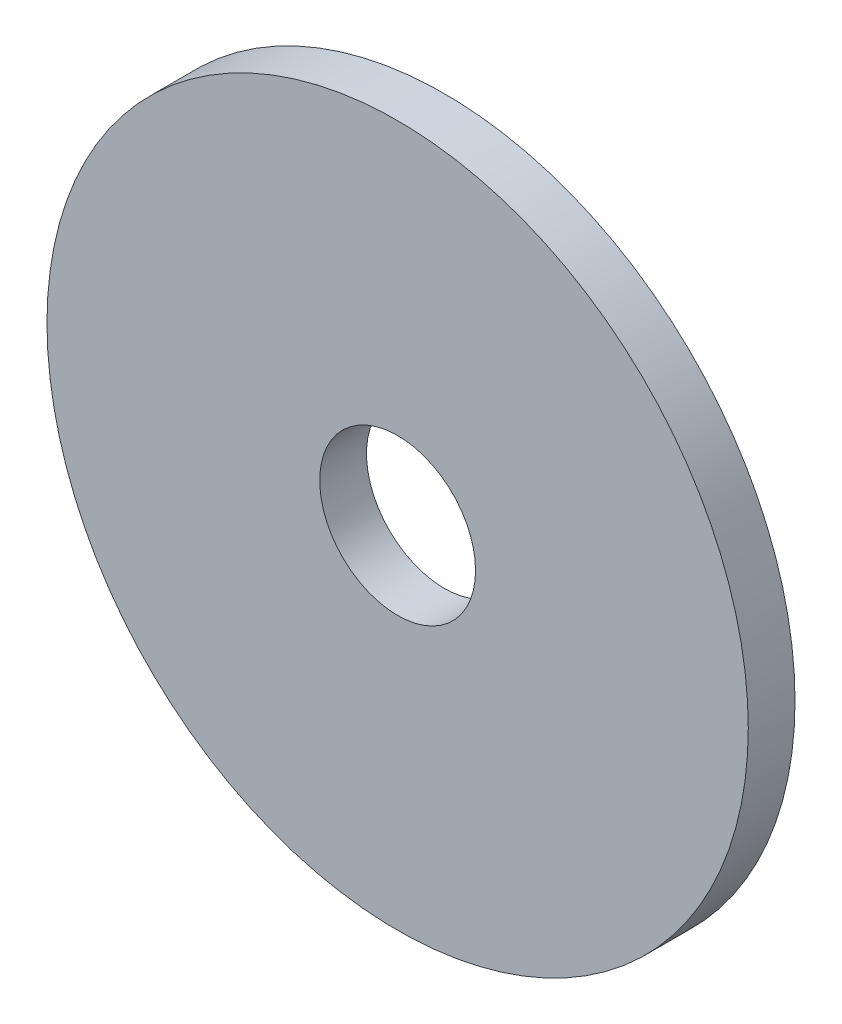
ISO-10303-21;
HEADER;
FILE_DESCRIPTION(('STEP AP214'),'2;1');
FILE_NAME('part.step','',(''),(''),'','','');
FILE_SCHEMA(('AUTOMOTIVE_DESIGN { 1 0 10303 214 1 1 1 1 }'));
ENDSEC;
DATA;
#1=APPLICATION_CONTEXT('core data for automotive mechanical design processes');
#2=APPLICATION_PROTOCOL_DEFINITION('international standard','automotive_design',2000,#1);
#3=PRODUCT_CONTEXT('',#1,'mechanical');
#4=PRODUCT('Part','Part','',(#3));
#5=PRODUCT_RELATED_PRODUCT_CATEGORY('part','',(#4));
#6=PRODUCT_DEFINITION_FORMATION('','',#4);
#7=PRODUCT_DEFINITION_CONTEXT('part definition',#1,'design');
#8=PRODUCT_DEFINITION('design','',#6,#7);
#9=PRODUCT_DEFINITION_SHAPE('','',#8);
#10=(LENGTH_UNIT() NAMED_UNIT(*) SI_UNIT(.MILLI.,.METRE.));
#11=(NAMED_UNIT(*) PLANE_ANGLE_UNIT() SI_UNIT($,.RADIAN.));
#12=(NAMED_UNIT(*) SI_UNIT($,.STERADIAN.) SOLID_ANGLE_UNIT());
#13=UNCERTAINTY_MEASURE_WITH_UNIT(LENGTH_MEASURE(1.E-05),#10,'distance_accuracy_value','');
#14=(GEOMETRIC_REPRESENTATION_CONTEXT(3) GLOBAL_UNCERTAINTY_ASSIGNED_CONTEXT((#13)) GLOBAL_UNIT_ASSIGNED_CONTEXT((#10,
#11,#12)) REPRESENTATION_CONTEXT('',''));
#15=CARTESIAN_POINT('',(0.,0.,0.));
#16=DIRECTION('',(0.,0.,1.));
#17=DIRECTION('',(1.,0.,0.));
#18=AXIS2_PLACEMENT_3D('',#15,#16,#17);
#19=CARTESIAN_POINT('',(0.,0.,3.));
#20=DIRECTION('',(0.,0.,1.));
#21=DIRECTION('',(1.,0.,0.));
#22=AXIS2_PLACEMENT_3D('',#19,#20,#21);
#23=PLANE('',#22);
#24=CARTESIAN_POINT('',(0.,0.,3.));
#25=DIRECTION('',(0.,0.,1.));
#26=DIRECTION('',(1.,0.,0.));
#27=AXIS2_PLACEMENT_3D('',#24,#25,#26);
#28=CIRCLE('',#27,22.5);
#29=CARTESIAN_POINT('',(22.5,0.,3.));
#30=VERTEX_POINT('',#29);
#31=EDGE_CURVE('E10',#30,#30,#28,.T.);
#32=ORIENTED_EDGE('',*,*,#31,.T.);
#33=EDGE_LOOP('',(#32));
#34=FACE_BOUND('',#33,.T.);
#35=CARTESIAN_POINT('',(0.,0.,3.));
#36=DIRECTION('',(0.,0.,1.));
#37=DIRECTION('',(1.,0.,0.));
#38=AXIS2_PLACEMENT_3D('',#35,#36,#37);
#39=CIRCLE('',#38,5.);
#40=CARTESIAN_POINT('',(5.,0.,3.));
#41=VERTEX_POINT('',#40);
#42=EDGE_CURVE('E56',#41,#41,#39,.T.);
#43=ORIENTED_EDGE('',*,*,#42,.F.);
#44=EDGE_LOOP('',(#43));
#45=FACE_BOUND('',#44,.T.);
#46=ADVANCED_FACE('F43',(#34,#45),#23,.T.);
#47=CARTESIAN_POINT('',(0.,0.,0.));
#48=DIRECTION('',(0.,0.,1.));
#49=DIRECTION('',(1.,0.,0.));
#50=AXIS2_PLACEMENT_3D('',#47,#48,#49);
#51=PLANE('',#50);
#52=CARTESIAN_POINT('',(0.,0.,0.));
#53=DIRECTION('',(0.,0.,1.));
#54=DIRECTION('',(1.,0.,0.));
#55=AXIS2_PLACEMENT_3D('',#52,#53,#54);
#56=CIRCLE('',#55,22.5);
#57=CARTESIAN_POINT('',(22.5,0.,0.));
#58=VERTEX_POINT('',#57);
#59=EDGE_CURVE('E47',#58,#58,#56,.T.);
#60=ORIENTED_EDGE('',*,*,#59,.F.);
#61=EDGE_LOOP('',(#60));
#62=FACE_BOUND('',#61,.T.);
#63=CARTESIAN_POINT('',(0.,0.,0.));
#64=DIRECTION('',(0.,0.,1.));
#65=DIRECTION('',(1.,0.,0.));
#66=AXIS2_PLACEMENT_3D('',#63,#64,#65);
#67=CIRCLE('',#66,5.);
#68=CARTESIAN_POINT('',(5.,0.,0.));
#69=VERTEX_POINT('',#68);
#70=EDGE_CURVE('E58',#69,#69,#67,.T.);
#71=ORIENTED_EDGE('',*,*,#70,.T.);
#72=EDGE_LOOP('',(#71));
#73=FACE_BOUND('',#72,.T.);
#74=ADVANCED_FACE('F70',(#62,#73),#51,.F.);
#75=CARTESIAN_POINT('',(0.,0.,3.));
#76=DIRECTION('',(0.,0.,-1.));
#77=DIRECTION('',(-1.,0.,0.));
#78=AXIS2_PLACEMENT_3D('',#75,#76,#77);
#79=CYLINDRICAL_SURFACE('',#78,22.5);
#80=ORIENTED_EDGE('',*,*,#31,.F.);
#81=EDGE_LOOP('',(#80));
#82=FACE_BOUND('',#81,.T.);
#83=ORIENTED_EDGE('',*,*,#59,.T.);
#84=EDGE_LOOP('',(#83));
#85=FACE_BOUND('',#84,.T.);
#86=ADVANCED_FACE('F45',(#82,#85),#79,.T.);
#87=CARTESIAN_POINT('',(0.,0.,3.));
#88=DIRECTION('',(0.,0.,-1.));
#89=DIRECTION('',(-1.,0.,0.));
#90=AXIS2_PLACEMENT_3D('',#87,#88,#89);
#91=CYLINDRICAL_SURFACE('',#90,5.);
#92=ORIENTED_EDGE('',*,*,#42,.T.);
#93=EDGE_LOOP('',(#92));
#94=FACE_BOUND('',#93,.T.);
#95=ORIENTED_EDGE('',*,*,#70,.F.);
#96=EDGE_LOOP('',(#95));
#97=FACE_BOUND('',#96,.T.);
#98=ADVANCED_FACE('F66',(#94,#97),#91,.F.);
#99=CLOSED_SHELL('',(#46,#74,#86,#98));
#100=MANIFOLD_SOLID_BREP('B2',#99);
#101=ADVANCED_BREP_SHAPE_REPRESENTATION('',(#18,#100),#14);
#102=SHAPE_DEFINITION_REPRESENTATION(#9,#101);
ENDSEC;
END-ISO-10303-21;
